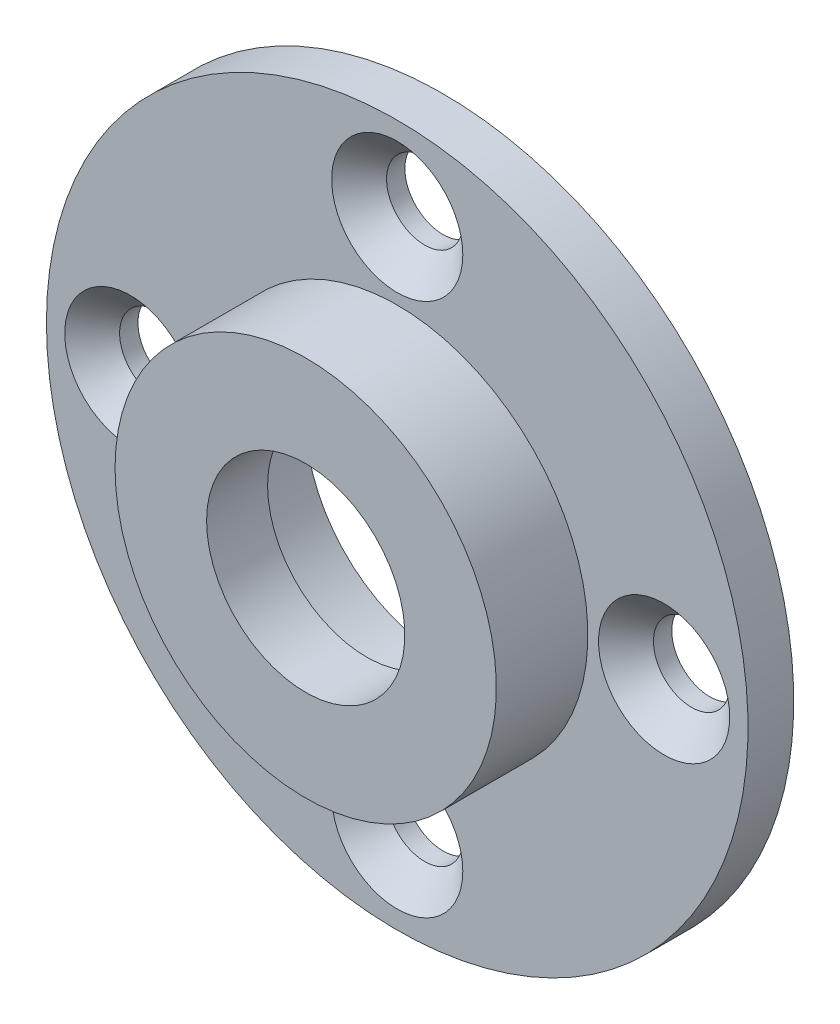
ISO-10303-21;
HEADER;
FILE_DESCRIPTION(('STEP AP214'),'2;1');
FILE_NAME('part.step','',(''),(''),'','','');
FILE_SCHEMA(('AUTOMOTIVE_DESIGN { 1 0 10303 214 1 1 1 1 }'));
ENDSEC;
DATA;
#1=APPLICATION_CONTEXT('core data for automotive mechanical design processes');
#2=APPLICATION_PROTOCOL_DEFINITION('international standard','automotive_design',2000,#1);
#3=PRODUCT_CONTEXT('',#1,'mechanical');
#4=PRODUCT('Part','Part','',(#3));
#5=PRODUCT_RELATED_PRODUCT_CATEGORY('part','',(#4));
#6=PRODUCT_DEFINITION_FORMATION('','',#4);
#7=PRODUCT_DEFINITION_CONTEXT('part definition',#1,'design');
#8=PRODUCT_DEFINITION('design','',#6,#7);
#9=PRODUCT_DEFINITION_SHAPE('','',#8);
#10=(LENGTH_UNIT() NAMED_UNIT(*) SI_UNIT(.MILLI.,.METRE.));
#11=(NAMED_UNIT(*) PLANE_ANGLE_UNIT() SI_UNIT($,.RADIAN.));
#12=(NAMED_UNIT(*) SI_UNIT($,.STERADIAN.) SOLID_ANGLE_UNIT());
#13=UNCERTAINTY_MEASURE_WITH_UNIT(LENGTH_MEASURE(1.E-05),#10,'distance_accuracy_value','');
#14=(GEOMETRIC_REPRESENTATION_CONTEXT(3) GLOBAL_UNCERTAINTY_ASSIGNED_CONTEXT((#13)) GLOBAL_UNIT_ASSIGNED_CONTEXT((#10,
#11,#12)) REPRESENTATION_CONTEXT('',''));
#15=CARTESIAN_POINT('',(0.,0.,0.));
#16=DIRECTION('',(0.,0.,1.));
#17=DIRECTION('',(1.,0.,0.));
#18=AXIS2_PLACEMENT_3D('',#15,#16,#17);
#19=CARTESIAN_POINT('',(23.,0.,-6.));
#20=DIRECTION('',(0.,0.,-1.));
#21=DIRECTION('',(-1.,0.,0.));
#22=AXIS2_PLACEMENT_3D('',#19,#20,#21);
#23=PLANE('',#22);
#24=CARTESIAN_POINT('',(17.5,0.,-6.));
#25=DIRECTION('',(0.,0.,1.));
#26=DIRECTION('',(1.,0.,0.));
#27=AXIS2_PLACEMENT_3D('',#24,#25,#26);
#28=CIRCLE('',#27,4.3);
#29=CARTESIAN_POINT('',(21.8,0.,-6.));
#30=VERTEX_POINT('',#29);
#31=EDGE_CURVE('E86',#30,#30,#28,.T.);
#32=ORIENTED_EDGE('',*,*,#31,.F.);
#33=EDGE_LOOP('',(#32));
#34=FACE_BOUND('',#33,.T.);
#35=CARTESIAN_POINT('',(0.,17.5,-6.));
#36=DIRECTION('',(0.,0.,1.));
#37=DIRECTION('',(1.,0.,0.));
#38=AXIS2_PLACEMENT_3D('',#35,#36,#37);
#39=CIRCLE('',#38,4.3);
#40=CARTESIAN_POINT('',(4.3,17.5,-6.));
#41=VERTEX_POINT('',#40);
#42=EDGE_CURVE('E77',#41,#41,#39,.T.);
#43=ORIENTED_EDGE('',*,*,#42,.F.);
#44=EDGE_LOOP('',(#43));
#45=FACE_BOUND('',#44,.T.);
#46=CARTESIAN_POINT('',(0.,0.,-6.));
#47=DIRECTION('',(0.,0.,-1.));
#48=DIRECTION('',(-1.,0.,0.));
#49=AXIS2_PLACEMENT_3D('',#46,#47,#48);
#50=CIRCLE('',#49,23.);
#51=CARTESIAN_POINT('',(-23.,0.,-6.));
#52=VERTEX_POINT('',#51);
#53=EDGE_CURVE('E62',#52,#52,#50,.T.);
#54=ORIENTED_EDGE('',*,*,#53,.F.);
#55=EDGE_LOOP('',(#54));
#56=FACE_BOUND('',#55,.T.);
#57=CARTESIAN_POINT('',(0.,0.,-6.));
#58=DIRECTION('',(0.,0.,-1.));
#59=DIRECTION('',(-1.,0.,0.));
#60=AXIS2_PLACEMENT_3D('',#57,#58,#59);
#61=CIRCLE('',#60,12.5);
#62=CARTESIAN_POINT('',(-12.5,0.,-6.));
#63=VERTEX_POINT('',#62);
#64=EDGE_CURVE('E65',#63,#63,#61,.T.);
#65=ORIENTED_EDGE('',*,*,#64,.T.);
#66=EDGE_LOOP('',(#65));
#67=FACE_BOUND('',#66,.T.);
#68=CARTESIAN_POINT('',(0.,-17.5,-6.));
#69=DIRECTION('',(0.,0.,1.));
#70=DIRECTION('',(1.,0.,0.));
#71=AXIS2_PLACEMENT_3D('',#68,#69,#70);
#72=CIRCLE('',#71,4.3);
#73=CARTESIAN_POINT('',(4.3,-17.5,-6.));
#74=VERTEX_POINT('',#73);
#75=EDGE_CURVE('E95',#74,#74,#72,.T.);
#76=ORIENTED_EDGE('',*,*,#75,.F.);
#77=EDGE_LOOP('',(#76));
#78=FACE_BOUND('',#77,.T.);
#79=CARTESIAN_POINT('',(-17.5,1.83302770265203E-13,-6.));
#80=DIRECTION('',(0.,0.,1.));
#81=DIRECTION('',(1.,0.,0.));
#82=AXIS2_PLACEMENT_3D('',#79,#80,#81);
#83=CIRCLE('',#82,4.3);
#84=CARTESIAN_POINT('',(-13.2,1.83302770265203E-13,-6.));
#85=VERTEX_POINT('',#84);
#86=EDGE_CURVE('E104',#85,#85,#83,.T.);
#87=ORIENTED_EDGE('',*,*,#86,.F.);
#88=EDGE_LOOP('',(#87));
#89=FACE_BOUND('',#88,.T.);
#90=ADVANCED_FACE('F39',(#34,#45,#56,#67,#78,#89),#23,.F.);
#91=CARTESIAN_POINT('',(12.5,0.,0.));
#92=DIRECTION('',(0.,0.,-1.));
#93=DIRECTION('',(-1.,0.,0.));
#94=AXIS2_PLACEMENT_3D('',#91,#92,#93);
#95=PLANE('',#94);
#96=CARTESIAN_POINT('',(0.,0.,0.));
#97=DIRECTION('',(0.,0.,-1.));
#98=DIRECTION('',(-1.,0.,0.));
#99=AXIS2_PLACEMENT_3D('',#96,#97,#98);
#100=CIRCLE('',#99,12.5);
#101=CARTESIAN_POINT('',(-12.5,0.,0.));
#102=VERTEX_POINT('',#101);
#103=EDGE_CURVE('E68',#102,#102,#100,.T.);
#104=ORIENTED_EDGE('',*,*,#103,.F.);
#105=EDGE_LOOP('',(#104));
#106=FACE_BOUND('',#105,.T.);
#107=CARTESIAN_POINT('',(0.,0.,0.));
#108=DIRECTION('',(0.,0.,-1.));
#109=DIRECTION('',(-1.,0.,0.));
#110=AXIS2_PLACEMENT_3D('',#107,#108,#109);
#111=CIRCLE('',#110,6.5);
#112=CARTESIAN_POINT('',(-6.5,0.,0.));
#113=VERTEX_POINT('',#112);
#114=EDGE_CURVE('E10',#113,#113,#111,.T.);
#115=ORIENTED_EDGE('',*,*,#114,.T.);
#116=EDGE_LOOP('',(#115));
#117=FACE_BOUND('',#116,.T.);
#118=ADVANCED_FACE('F41',(#106,#117),#95,.F.);
#119=CARTESIAN_POINT('',(0.,0.,-7.57432432432432));
#120=DIRECTION('',(0.,0.,-1.));
#121=DIRECTION('',(-1.,0.,0.));
#122=AXIS2_PLACEMENT_3D('',#119,#120,#121);
#123=CYLINDRICAL_SURFACE('',#122,6.5);
#124=ORIENTED_EDGE('',*,*,#114,.F.);
#125=EDGE_LOOP('',(#124));
#126=FACE_BOUND('',#125,.T.);
#127=CARTESIAN_POINT('',(0.,0.,-4.));
#128=DIRECTION('',(0.,0.,-1.));
#129=DIRECTION('',(-1.,0.,0.));
#130=AXIS2_PLACEMENT_3D('',#127,#128,#129);
#131=CIRCLE('',#130,6.5);
#132=CARTESIAN_POINT('',(-6.5,0.,-4.));
#133=VERTEX_POINT('',#132);
#134=EDGE_CURVE('E46',#133,#133,#131,.T.);
#135=ORIENTED_EDGE('',*,*,#134,.T.);
#136=EDGE_LOOP('',(#135));
#137=FACE_BOUND('',#136,.T.);
#138=ADVANCED_FACE('F116',(#126,#137),#123,.F.);
#139=CARTESIAN_POINT('',(6.5,0.,-4.));
#140=DIRECTION('',(0.,0.,1.));
#141=DIRECTION('',(1.,0.,0.));
#142=AXIS2_PLACEMENT_3D('',#139,#140,#141);
#143=PLANE('',#142);
#144=ORIENTED_EDGE('',*,*,#134,.F.);
#145=EDGE_LOOP('',(#144));
#146=FACE_BOUND('',#145,.T.);
#147=CARTESIAN_POINT('',(0.,0.,-4.));
#148=DIRECTION('',(0.,0.,-1.));
#149=DIRECTION('',(-1.,0.,0.));
#150=AXIS2_PLACEMENT_3D('',#147,#148,#149);
#151=CIRCLE('',#150,9.);
#152=CARTESIAN_POINT('',(-9.,0.,-4.));
#153=VERTEX_POINT('',#152);
#154=EDGE_CURVE('E50',#153,#153,#151,.T.);
#155=ORIENTED_EDGE('',*,*,#154,.T.);
#156=EDGE_LOOP('',(#155));
#157=FACE_BOUND('',#156,.T.);
#158=ADVANCED_FACE('F135',(#146,#157),#143,.F.);
#159=CARTESIAN_POINT('',(0.,0.,-7.57432432432432));
#160=DIRECTION('',(0.,0.,-1.));
#161=DIRECTION('',(-1.,0.,0.));
#162=AXIS2_PLACEMENT_3D('',#159,#160,#161);
#163=CYLINDRICAL_SURFACE('',#162,9.);
#164=ORIENTED_EDGE('',*,*,#154,.F.);
#165=EDGE_LOOP('',(#164));
#166=FACE_BOUND('',#165,.T.);
#167=CARTESIAN_POINT('',(0.,0.,-9.));
#168=DIRECTION('',(0.,0.,-1.));
#169=DIRECTION('',(-1.,0.,0.));
#170=AXIS2_PLACEMENT_3D('',#167,#168,#169);
#171=CIRCLE('',#170,9.);
#172=CARTESIAN_POINT('',(-9.,0.,-9.));
#173=VERTEX_POINT('',#172);
#174=EDGE_CURVE('E54',#173,#173,#171,.T.);
#175=ORIENTED_EDGE('',*,*,#174,.T.);
#176=EDGE_LOOP('',(#175));
#177=FACE_BOUND('',#176,.T.);
#178=ADVANCED_FACE('F131',(#166,#177),#163,.F.);
#179=CARTESIAN_POINT('',(9.,0.,-9.));
#180=DIRECTION('',(0.,0.,1.));
#181=DIRECTION('',(1.,0.,0.));
#182=AXIS2_PLACEMENT_3D('',#179,#180,#181);
#183=PLANE('',#182);
#184=CARTESIAN_POINT('',(-17.5,1.83302770265203E-13,-9.));
#185=DIRECTION('',(0.,0.,1.));
#186=DIRECTION('',(1.,0.,0.));
#187=AXIS2_PLACEMENT_3D('',#184,#185,#186);
#188=CIRCLE('',#187,2.5);
#189=CARTESIAN_POINT('',(-15.,1.83302770265203E-13,-9.));
#190=VERTEX_POINT('',#189);
#191=EDGE_CURVE('E98',#190,#190,#188,.T.);
#192=ORIENTED_EDGE('',*,*,#191,.T.);
#193=EDGE_LOOP('',(#192));
#194=FACE_BOUND('',#193,.T.);
#195=CARTESIAN_POINT('',(0.,-17.5,-9.));
#196=DIRECTION('',(0.,0.,1.));
#197=DIRECTION('',(1.,0.,0.));
#198=AXIS2_PLACEMENT_3D('',#195,#196,#197);
#199=CIRCLE('',#198,2.5);
#200=CARTESIAN_POINT('',(2.5,-17.5,-9.));
#201=VERTEX_POINT('',#200);
#202=EDGE_CURVE('E89',#201,#201,#199,.T.);
#203=ORIENTED_EDGE('',*,*,#202,.T.);
#204=EDGE_LOOP('',(#203));
#205=FACE_BOUND('',#204,.T.);
#206=CARTESIAN_POINT('',(17.5,0.,-9.));
#207=DIRECTION('',(0.,0.,1.));
#208=DIRECTION('',(1.,0.,0.));
#209=AXIS2_PLACEMENT_3D('',#206,#207,#208);
#210=CIRCLE('',#209,2.5);
#211=CARTESIAN_POINT('',(20.,0.,-9.));
#212=VERTEX_POINT('',#211);
#213=EDGE_CURVE('E80',#212,#212,#210,.T.);
#214=ORIENTED_EDGE('',*,*,#213,.T.);
#215=EDGE_LOOP('',(#214));
#216=FACE_BOUND('',#215,.T.);
#217=CARTESIAN_POINT('',(0.,17.5,-9.));
#218=DIRECTION('',(0.,0.,1.));
#219=DIRECTION('',(1.,0.,0.));
#220=AXIS2_PLACEMENT_3D('',#217,#218,#219);
#221=CIRCLE('',#220,2.5);
#222=CARTESIAN_POINT('',(2.5,17.5,-9.));
#223=VERTEX_POINT('',#222);
#224=EDGE_CURVE('E71',#223,#223,#221,.T.);
#225=ORIENTED_EDGE('',*,*,#224,.T.);
#226=EDGE_LOOP('',(#225));
#227=FACE_BOUND('',#226,.T.);
#228=ORIENTED_EDGE('',*,*,#174,.F.);
#229=EDGE_LOOP('',(#228));
#230=FACE_BOUND('',#229,.T.);
#231=CARTESIAN_POINT('',(0.,0.,-9.));
#232=DIRECTION('',(0.,0.,-1.));
#233=DIRECTION('',(-1.,0.,0.));
#234=AXIS2_PLACEMENT_3D('',#231,#232,#233);
#235=CIRCLE('',#234,23.);
#236=CARTESIAN_POINT('',(-23.,0.,-9.));
#237=VERTEX_POINT('',#236);
#238=EDGE_CURVE('E59',#237,#237,#235,.T.);
#239=ORIENTED_EDGE('',*,*,#238,.T.);
#240=EDGE_LOOP('',(#239));
#241=FACE_BOUND('',#240,.T.);
#242=ADVANCED_FACE('F127',(#194,#205,#216,#227,#230,#241),#183,.F.);
#243=CARTESIAN_POINT('',(0.,0.,-7.57432432432432));
#244=DIRECTION('',(0.,0.,-1.));
#245=DIRECTION('',(-1.,0.,0.));
#246=AXIS2_PLACEMENT_3D('',#243,#244,#245);
#247=CYLINDRICAL_SURFACE('',#246,23.);
#248=ORIENTED_EDGE('',*,*,#238,.F.);
#249=EDGE_LOOP('',(#248));
#250=FACE_BOUND('',#249,.T.);
#251=ORIENTED_EDGE('',*,*,#53,.T.);
#252=EDGE_LOOP('',(#251));
#253=FACE_BOUND('',#252,.T.);
#254=ADVANCED_FACE('F124',(#250,#253),#247,.T.);
#255=CARTESIAN_POINT('',(0.,0.,-7.57432432432432));
#256=DIRECTION('',(0.,0.,-1.));
#257=DIRECTION('',(-1.,0.,0.));
#258=AXIS2_PLACEMENT_3D('',#255,#256,#257);
#259=CYLINDRICAL_SURFACE('',#258,12.5);
#260=ORIENTED_EDGE('',*,*,#64,.F.);
#261=EDGE_LOOP('',(#260));
#262=FACE_BOUND('',#261,.T.);
#263=ORIENTED_EDGE('',*,*,#103,.T.);
#264=EDGE_LOOP('',(#263));
#265=FACE_BOUND('',#264,.T.);
#266=ADVANCED_FACE('F122',(#262,#265),#259,.T.);
#267=CARTESIAN_POINT('',(0.,17.5,-6.));
#268=DIRECTION('',(0.,0.,1.));
#269=DIRECTION('',(1.,0.,0.));
#270=AXIS2_PLACEMENT_3D('',#267,#268,#269);
#271=CYLINDRICAL_SURFACE('',#270,2.5);
#272=ORIENTED_EDGE('',*,*,#224,.F.);
#273=EDGE_LOOP('',(#272));
#274=FACE_BOUND('',#273,.T.);
#275=CARTESIAN_POINT('',(0.,17.5,-7.8));
#276=DIRECTION('',(0.,0.,1.));
#277=DIRECTION('',(1.,0.,0.));
#278=AXIS2_PLACEMENT_3D('',#275,#276,#277);
#279=CIRCLE('',#278,2.5);
#280=CARTESIAN_POINT('',(2.5,17.5,-7.8));
#281=VERTEX_POINT('',#280);
#282=EDGE_CURVE('E74',#281,#281,#279,.T.);
#283=ORIENTED_EDGE('',*,*,#282,.T.);
#284=EDGE_LOOP('',(#283));
#285=FACE_BOUND('',#284,.T.);
#286=ADVANCED_FACE('F168',(#274,#285),#271,.F.);
#287=CARTESIAN_POINT('',(0.,17.5,-6.));
#288=DIRECTION('',(0.,0.,1.));
#289=DIRECTION('',(1.,0.,0.));
#290=AXIS2_PLACEMENT_3D('',#287,#288,#289);
#291=CONICAL_SURFACE('',#290,4.3,0.785398163397448);
#292=ORIENTED_EDGE('',*,*,#282,.F.);
#293=EDGE_LOOP('',(#292));
#294=FACE_BOUND('',#293,.T.);
#295=ORIENTED_EDGE('',*,*,#42,.T.);
#296=EDGE_LOOP('',(#295));
#297=FACE_BOUND('',#296,.T.);
#298=ADVANCED_FACE('F175',(#294,#297),#291,.F.);
#299=CARTESIAN_POINT('',(17.5,0.,-6.));
#300=DIRECTION('',(0.,0.,1.));
#301=DIRECTION('',(1.,0.,0.));
#302=AXIS2_PLACEMENT_3D('',#299,#300,#301);
#303=CYLINDRICAL_SURFACE('',#302,2.5);
#304=ORIENTED_EDGE('',*,*,#213,.F.);
#305=EDGE_LOOP('',(#304));
#306=FACE_BOUND('',#305,.T.);
#307=CARTESIAN_POINT('',(17.5,0.,-7.8));
#308=DIRECTION('',(0.,0.,1.));
#309=DIRECTION('',(1.,0.,0.));
#310=AXIS2_PLACEMENT_3D('',#307,#308,#309);
#311=CIRCLE('',#310,2.5);
#312=CARTESIAN_POINT('',(20.,0.,-7.8));
#313=VERTEX_POINT('',#312);
#314=EDGE_CURVE('E83',#313,#313,#311,.T.);
#315=ORIENTED_EDGE('',*,*,#314,.T.);
#316=EDGE_LOOP('',(#315));
#317=FACE_BOUND('',#316,.T.);
#318=ADVANCED_FACE('F182',(#306,#317),#303,.F.);
#319=CARTESIAN_POINT('',(17.5,0.,-6.));
#320=DIRECTION('',(0.,0.,1.));
#321=DIRECTION('',(1.,0.,0.));
#322=AXIS2_PLACEMENT_3D('',#319,#320,#321);
#323=CONICAL_SURFACE('',#322,4.3,0.785398163397448);
#324=ORIENTED_EDGE('',*,*,#314,.F.);
#325=EDGE_LOOP('',(#324));
#326=FACE_BOUND('',#325,.T.);
#327=ORIENTED_EDGE('',*,*,#31,.T.);
#328=EDGE_LOOP('',(#327));
#329=FACE_BOUND('',#328,.T.);
#330=ADVANCED_FACE('F189',(#326,#329),#323,.F.);
#331=CARTESIAN_POINT('',(0.,-17.5,-6.));
#332=DIRECTION('',(0.,0.,1.));
#333=DIRECTION('',(1.,0.,0.));
#334=AXIS2_PLACEMENT_3D('',#331,#332,#333);
#335=CYLINDRICAL_SURFACE('',#334,2.5);
#336=ORIENTED_EDGE('',*,*,#202,.F.);
#337=EDGE_LOOP('',(#336));
#338=FACE_BOUND('',#337,.T.);
#339=CARTESIAN_POINT('',(0.,-17.5,-7.8));
#340=DIRECTION('',(0.,0.,1.));
#341=DIRECTION('',(1.,0.,0.));
#342=AXIS2_PLACEMENT_3D('',#339,#340,#341);
#343=CIRCLE('',#342,2.5);
#344=CARTESIAN_POINT('',(2.5,-17.5,-7.8));
#345=VERTEX_POINT('',#344);
#346=EDGE_CURVE('E92',#345,#345,#343,.T.);
#347=ORIENTED_EDGE('',*,*,#346,.T.);
#348=EDGE_LOOP('',(#347));
#349=FACE_BOUND('',#348,.T.);
#350=ADVANCED_FACE('F197',(#338,#349),#335,.F.);
#351=CARTESIAN_POINT('',(0.,-17.5,-6.));
#352=DIRECTION('',(0.,0.,1.));
#353=DIRECTION('',(1.,0.,0.));
#354=AXIS2_PLACEMENT_3D('',#351,#352,#353);
#355=CONICAL_SURFACE('',#354,4.3,0.785398163397448);
#356=ORIENTED_EDGE('',*,*,#346,.F.);
#357=EDGE_LOOP('',(#356));
#358=FACE_BOUND('',#357,.T.);
#359=ORIENTED_EDGE('',*,*,#75,.T.);
#360=EDGE_LOOP('',(#359));
#361=FACE_BOUND('',#360,.T.);
#362=ADVANCED_FACE('F205',(#358,#361),#355,.F.);
#363=CARTESIAN_POINT('',(-17.5,1.83302770265203E-13,-6.));
#364=DIRECTION('',(0.,0.,1.));
#365=DIRECTION('',(1.,0.,0.));
#366=AXIS2_PLACEMENT_3D('',#363,#364,#365);
#367=CYLINDRICAL_SURFACE('',#366,2.5);
#368=ORIENTED_EDGE('',*,*,#191,.F.);
#369=EDGE_LOOP('',(#368));
#370=FACE_BOUND('',#369,.T.);
#371=CARTESIAN_POINT('',(-17.5,1.83302770265203E-13,-7.8));
#372=DIRECTION('',(0.,0.,1.));
#373=DIRECTION('',(1.,0.,0.));
#374=AXIS2_PLACEMENT_3D('',#371,#372,#373);
#375=CIRCLE('',#374,2.5);
#376=CARTESIAN_POINT('',(-15.,1.83302770265203E-13,-7.8));
#377=VERTEX_POINT('',#376);
#378=EDGE_CURVE('E101',#377,#377,#375,.T.);
#379=ORIENTED_EDGE('',*,*,#378,.T.);
#380=EDGE_LOOP('',(#379));
#381=FACE_BOUND('',#380,.T.);
#382=ADVANCED_FACE('F213',(#370,#381),#367,.F.);
#383=CARTESIAN_POINT('',(-17.5,1.83302770265203E-13,-6.));
#384=DIRECTION('',(0.,0.,1.));
#385=DIRECTION('',(1.,0.,0.));
#386=AXIS2_PLACEMENT_3D('',#383,#384,#385);
#387=CONICAL_SURFACE('',#386,4.3,0.785398163397448);
#388=ORIENTED_EDGE('',*,*,#378,.F.);
#389=EDGE_LOOP('',(#388));
#390=FACE_BOUND('',#389,.T.);
#391=ORIENTED_EDGE('',*,*,#86,.T.);
#392=EDGE_LOOP('',(#391));
#393=FACE_BOUND('',#392,.T.);
#394=ADVANCED_FACE('F108',(#390,#393),#387,.F.);
#395=CLOSED_SHELL('',(#90,#118,#138,#158,#178,#242,#254,#266,#286,#298,#318,#330,#350,#362,#382,#394));
#396=MANIFOLD_SOLID_BREP('B2',#395);
#397=ADVANCED_BREP_SHAPE_REPRESENTATION('',(#18,#396),#14);
#398=SHAPE_DEFINITION_REPRESENTATION(#9,#397);
ENDSEC;
END-ISO-10303-21;
